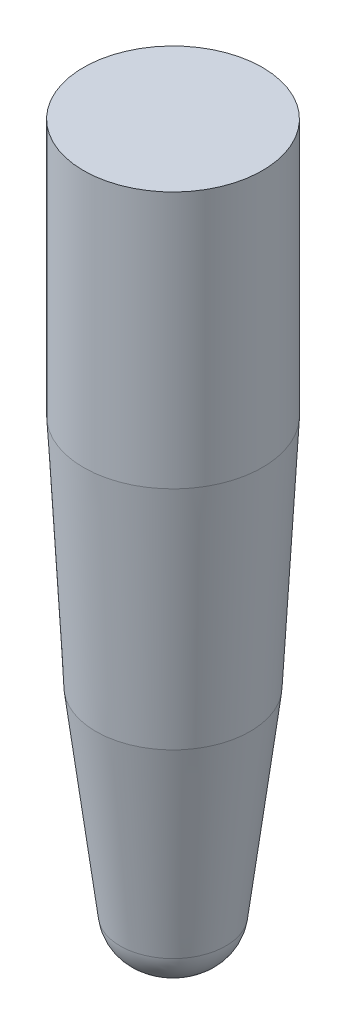
ISO-10303-21;
HEADER;
FILE_DESCRIPTION(('STEP AP214'),'2;1');
FILE_NAME('part.step','',(''),(''),'','','');
FILE_SCHEMA(('AUTOMOTIVE_DESIGN { 1 0 10303 214 1 1 1 1 }'));
ENDSEC;
DATA;
#1=APPLICATION_CONTEXT('core data for automotive mechanical design processes');
#2=APPLICATION_PROTOCOL_DEFINITION('international standard','automotive_design',2000,#1);
#3=PRODUCT_CONTEXT('',#1,'mechanical');
#4=PRODUCT('Part','Part','',(#3));
#5=PRODUCT_RELATED_PRODUCT_CATEGORY('part','',(#4));
#6=PRODUCT_DEFINITION_FORMATION('','',#4);
#7=PRODUCT_DEFINITION_CONTEXT('part definition',#1,'design');
#8=PRODUCT_DEFINITION('design','',#6,#7);
#9=PRODUCT_DEFINITION_SHAPE('','',#8);
#10=(LENGTH_UNIT() NAMED_UNIT(*) SI_UNIT(.MILLI.,.METRE.));
#11=(NAMED_UNIT(*) PLANE_ANGLE_UNIT() SI_UNIT($,.RADIAN.));
#12=(NAMED_UNIT(*) SI_UNIT($,.STERADIAN.) SOLID_ANGLE_UNIT());
#13=UNCERTAINTY_MEASURE_WITH_UNIT(LENGTH_MEASURE(1.E-05),#10,'distance_accuracy_value','');
#14=(GEOMETRIC_REPRESENTATION_CONTEXT(3) GLOBAL_UNCERTAINTY_ASSIGNED_CONTEXT((#13)) GLOBAL_UNIT_ASSIGNED_CONTEXT((#10,
#11,#12)) REPRESENTATION_CONTEXT('',''));
#15=CARTESIAN_POINT('',(0.,0.,0.));
#16=DIRECTION('',(0.,0.,1.));
#17=DIRECTION('',(1.,0.,0.));
#18=AXIS2_PLACEMENT_3D('',#15,#16,#17);
#19=CARTESIAN_POINT('',(0.,23.,0.));
#20=DIRECTION('',(0.,-1.,0.));
#21=DIRECTION('',(0.,0.,-1.));
#22=AXIS2_PLACEMENT_3D('',#19,#20,#21);
#23=CYLINDRICAL_SURFACE('',#22,8.);
#24=CARTESIAN_POINT('',(0.,23.,0.));
#25=DIRECTION('',(0.,1.,0.));
#26=DIRECTION('',(0.,0.,1.));
#27=AXIS2_PLACEMENT_3D('',#24,#25,#26);
#28=CIRCLE('',#27,8.);
#29=CARTESIAN_POINT('',(0.,23.,8.));
#30=VERTEX_POINT('',#29);
#31=EDGE_CURVE('E10',#30,#30,#28,.T.);
#32=ORIENTED_EDGE('',*,*,#31,.F.);
#33=EDGE_LOOP('',(#32));
#34=FACE_BOUND('',#33,.T.);
#35=CARTESIAN_POINT('',(0.,0.,0.));
#36=DIRECTION('',(0.,1.,0.));
#37=DIRECTION('',(0.,0.,1.));
#38=AXIS2_PLACEMENT_3D('',#35,#36,#37);
#39=CIRCLE('',#38,8.);
#40=CARTESIAN_POINT('',(0.,0.,8.));
#41=VERTEX_POINT('',#40);
#42=EDGE_CURVE('E40',#41,#41,#39,.T.);
#43=ORIENTED_EDGE('',*,*,#42,.T.);
#44=EDGE_LOOP('',(#43));
#45=FACE_BOUND('',#44,.T.);
#46=ADVANCED_FACE('F34',(#34,#45),#23,.T.);
#47=CARTESIAN_POINT('',(0.,23.,0.));
#48=DIRECTION('',(0.,1.,0.));
#49=DIRECTION('',(0.,0.,1.));
#50=AXIS2_PLACEMENT_3D('',#47,#48,#49);
#51=PLANE('',#50);
#52=ORIENTED_EDGE('',*,*,#31,.T.);
#53=EDGE_LOOP('',(#52));
#54=FACE_BOUND('',#53,.T.);
#55=ADVANCED_FACE('F78',(#54),#51,.T.);
#56=CARTESIAN_POINT('',(0.,0.,0.));
#57=DIRECTION('',(0.,1.,0.));
#58=DIRECTION('',(0.,0.,1.));
#59=AXIS2_PLACEMENT_3D('',#56,#57,#58);
#60=CONICAL_SURFACE('',#59,8.,0.05235987755983);
#61=CARTESIAN_POINT('',(0.,-21.,0.));
#62=DIRECTION('',(0.,1.,0.));
#63=DIRECTION('',(-1.,0.,0.));
#64=AXIS2_PLACEMENT_3D('',#61,#62,#63);
#65=CIRCLE('',#64,6.89943663505613);
#66=CARTESIAN_POINT('',(-6.89943663505613,-21.,0.));
#67=VERTEX_POINT('',#66);
#68=EDGE_CURVE('E53',#67,#67,#65,.T.);
#69=ORIENTED_EDGE('',*,*,#68,.T.);
#70=EDGE_LOOP('',(#69));
#71=FACE_BOUND('',#70,.T.);
#72=ORIENTED_EDGE('',*,*,#42,.F.);
#73=EDGE_LOOP('',(#72));
#74=FACE_BOUND('',#73,.T.);
#75=ADVANCED_FACE('F57',(#71,#74),#60,.T.);
#76=CARTESIAN_POINT('',(0.,-38.7037930825314,0.));
#77=DIRECTION('',(0.,1.,0.));
#78=DIRECTION('',(-1.,0.,0.));
#79=AXIS2_PLACEMENT_3D('',#76,#77,#78);
#80=CONICAL_SURFACE('',#79,4.72568417510157,0.122173047639607);
#81=ORIENTED_EDGE('',*,*,#68,.F.);
#82=EDGE_LOOP('',(#81));
#83=FACE_BOUND('',#82,.T.);
#84=CARTESIAN_POINT('',(0.,-38.7037930825314,0.));
#85=DIRECTION('',(0.,1.,0.));
#86=DIRECTION('',(-1.,0.,0.));
#87=AXIS2_PLACEMENT_3D('',#84,#85,#86);
#88=CIRCLE('',#87,4.72568417510157);
#89=CARTESIAN_POINT('',(-4.72568417510157,-38.7037930825314,0.));
#90=VERTEX_POINT('',#89);
#91=EDGE_CURVE('E44',#90,#90,#88,.T.);
#92=ORIENTED_EDGE('',*,*,#91,.T.);
#93=EDGE_LOOP('',(#92));
#94=FACE_BOUND('',#93,.T.);
#95=ADVANCED_FACE('F60',(#83,#94),#80,.T.);
#96=CARTESIAN_POINT('',(0.,-38.2463365870286,0.));
#97=DIRECTION('',(0.,1.,0.));
#98=DIRECTION('',(-1.,0.,0.));
#99=AXIS2_PLACEMENT_3D('',#96,#97,#98);
#100=DEGENERATE_TOROIDAL_SURFACE('',#99,1.,3.75366341297138,.T.);
#101=ORIENTED_EDGE('',*,*,#91,.F.);
#102=EDGE_LOOP('',(#101));
#103=FACE_BOUND('',#102,.T.);
#104=CARTESIAN_POINT('',(0.,-42.,0.));
#105=DIRECTION('',(0.,1.,0.));
#106=DIRECTION('',(-1.,0.,0.));
#107=AXIS2_PLACEMENT_3D('',#104,#105,#106);
#108=CIRCLE('',#107,1.);
#109=CARTESIAN_POINT('',(-0.999999999999997,-42.,0.));
#110=VERTEX_POINT('',#109);
#111=EDGE_CURVE('E48',#110,#110,#108,.T.);
#112=ORIENTED_EDGE('',*,*,#111,.T.);
#113=EDGE_LOOP('',(#112));
#114=FACE_BOUND('',#113,.T.);
#115=ADVANCED_FACE('F63',(#103,#114),#100,.T.);
#116=CARTESIAN_POINT('',(0.,-42.,0.));
#117=DIRECTION('',(0.,1.,0.));
#118=DIRECTION('',(-1.,0.,0.));
#119=AXIS2_PLACEMENT_3D('',#116,#117,#118);
#120=PLANE('',#119);
#121=ORIENTED_EDGE('',*,*,#111,.F.);
#122=EDGE_LOOP('',(#121));
#123=FACE_BOUND('',#122,.T.);
#124=ADVANCED_FACE('F69',(#123),#120,.F.);
#125=CLOSED_SHELL('',(#46,#55,#75,#95,#115,#124));
#126=MANIFOLD_SOLID_BREP('B2',#125);
#127=ADVANCED_BREP_SHAPE_REPRESENTATION('',(#18,#126),#14);
#128=SHAPE_DEFINITION_REPRESENTATION(#9,#127);
ENDSEC;
END-ISO-10303-21;
